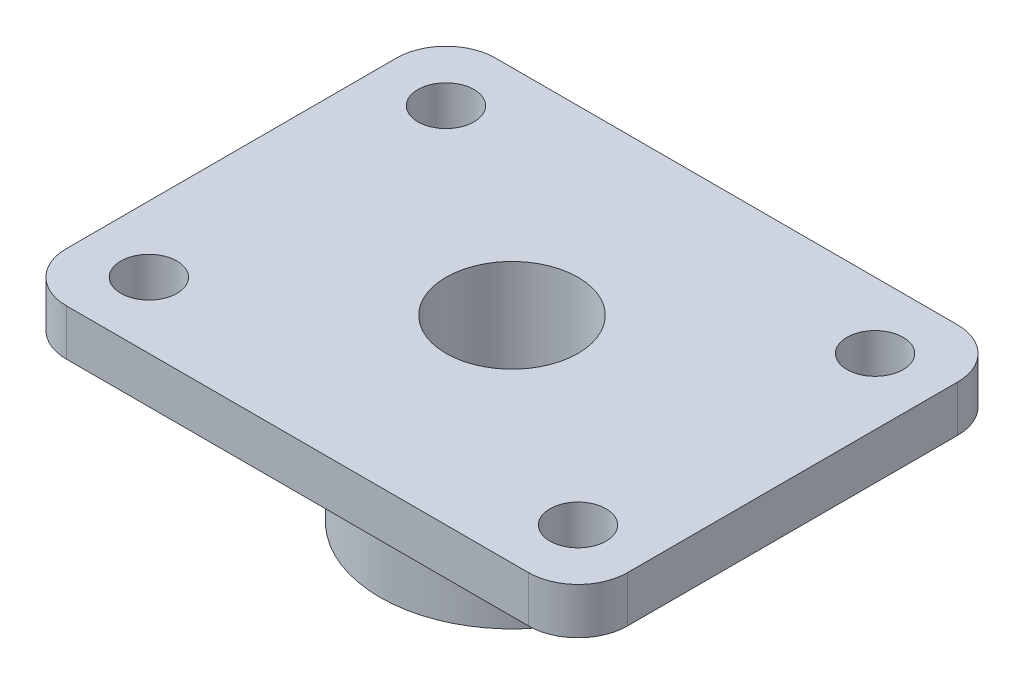
ISO-10303-21;
HEADER;
FILE_DESCRIPTION(('STEP AP214'),'2;1');
FILE_NAME('part.step','',(''),(''),'','','');
FILE_SCHEMA(('AUTOMOTIVE_DESIGN { 1 0 10303 214 1 1 1 1 }'));
ENDSEC;
DATA;
#1=APPLICATION_CONTEXT('core data for automotive mechanical design processes');
#2=APPLICATION_PROTOCOL_DEFINITION('international standard','automotive_design',2000,#1);
#3=PRODUCT_CONTEXT('',#1,'mechanical');
#4=PRODUCT('Part','Part','',(#3));
#5=PRODUCT_RELATED_PRODUCT_CATEGORY('part','',(#4));
#6=PRODUCT_DEFINITION_FORMATION('','',#4);
#7=PRODUCT_DEFINITION_CONTEXT('part definition',#1,'design');
#8=PRODUCT_DEFINITION('design','',#6,#7);
#9=PRODUCT_DEFINITION_SHAPE('','',#8);
#10=(LENGTH_UNIT() NAMED_UNIT(*) SI_UNIT(.MILLI.,.METRE.));
#11=(NAMED_UNIT(*) PLANE_ANGLE_UNIT() SI_UNIT($,.RADIAN.));
#12=(NAMED_UNIT(*) SI_UNIT($,.STERADIAN.) SOLID_ANGLE_UNIT());
#13=UNCERTAINTY_MEASURE_WITH_UNIT(LENGTH_MEASURE(1.E-05),#10,'distance_accuracy_value','');
#14=(GEOMETRIC_REPRESENTATION_CONTEXT(3) GLOBAL_UNCERTAINTY_ASSIGNED_CONTEXT((#13)) GLOBAL_UNIT_ASSIGNED_CONTEXT((#10,
#11,#12)) REPRESENTATION_CONTEXT('',''));
#15=CARTESIAN_POINT('',(0.,0.,0.));
#16=DIRECTION('',(0.,0.,1.));
#17=DIRECTION('',(1.,0.,0.));
#18=AXIS2_PLACEMENT_3D('',#15,#16,#17);
#19=CARTESIAN_POINT('',(70.,0.,50.));
#20=DIRECTION('',(0.,1.,0.));
#21=DIRECTION('',(0.,0.,1.));
#22=AXIS2_PLACEMENT_3D('',#19,#20,#21);
#23=PLANE('',#22);
#24=CARTESIAN_POINT('',(-65.0000000000003,0.,-44.9999999999995));
#25=DIRECTION('',(0.,1.,0.));
#26=DIRECTION('',(0.,0.,1.));
#27=AXIS2_PLACEMENT_3D('',#24,#25,#26);
#28=CIRCLE('',#27,8.50000000000001);
#29=CARTESIAN_POINT('',(-65.0000000000003,0.,-36.4999999999995));
#30=VERTEX_POINT('',#29);
#31=EDGE_CURVE('E205',#30,#30,#28,.T.);
#32=ORIENTED_EDGE('',*,*,#31,.T.);
#33=EDGE_LOOP('',(#32));
#34=FACE_BOUND('',#33,.T.);
#35=CARTESIAN_POINT('',(-64.9999999999997,0.,45.0000000000004));
#36=DIRECTION('',(0.,1.,0.));
#37=DIRECTION('',(0.,0.,-1.));
#38=AXIS2_PLACEMENT_3D('',#35,#36,#37);
#39=CIRCLE('',#38,8.49999999999998);
#40=CARTESIAN_POINT('',(-64.9999999999997,0.,36.5000000000005));
#41=VERTEX_POINT('',#40);
#42=EDGE_CURVE('E199',#41,#41,#39,.T.);
#43=ORIENTED_EDGE('',*,*,#42,.T.);
#44=EDGE_LOOP('',(#43));
#45=FACE_BOUND('',#44,.T.);
#46=CARTESIAN_POINT('',(65.,0.,-45.));
#47=DIRECTION('',(0.,1.,0.));
#48=DIRECTION('',(0.,0.,-1.));
#49=AXIS2_PLACEMENT_3D('',#46,#47,#48);
#50=CIRCLE('',#49,8.5);
#51=CARTESIAN_POINT('',(65.,0.,-53.5));
#52=VERTEX_POINT('',#51);
#53=EDGE_CURVE('E193',#52,#52,#50,.T.);
#54=ORIENTED_EDGE('',*,*,#53,.T.);
#55=EDGE_LOOP('',(#54));
#56=FACE_BOUND('',#55,.T.);
#57=CARTESIAN_POINT('',(65.,0.,45.));
#58=DIRECTION('',(0.,1.,0.));
#59=DIRECTION('',(0.,0.,1.));
#60=AXIS2_PLACEMENT_3D('',#57,#58,#59);
#61=CIRCLE('',#60,8.5);
#62=CARTESIAN_POINT('',(65.,0.,53.5));
#63=VERTEX_POINT('',#62);
#64=EDGE_CURVE('E187',#63,#63,#61,.T.);
#65=ORIENTED_EDGE('',*,*,#64,.T.);
#66=EDGE_LOOP('',(#65));
#67=FACE_BOUND('',#66,.T.);
#68=CARTESIAN_POINT('',(70.,0.,50.));
#69=DIRECTION('',(0.,1.,0.));
#70=DIRECTION('',(0.,0.,1.));
#71=AXIS2_PLACEMENT_3D('',#68,#69,#70);
#72=CIRCLE('',#71,15.);
#73=CARTESIAN_POINT('',(69.9999999999999,0.,65.));
#74=VERTEX_POINT('',#73);
#75=CARTESIAN_POINT('',(85.,0.,49.9999999999999));
#76=VERTEX_POINT('',#75);
#77=EDGE_CURVE('E132',#74,#76,#72,.T.);
#78=ORIENTED_EDGE('',*,*,#77,.F.);
#79=DIRECTION('',(1.,0.,0.));
#80=VECTOR('',#79,1.);
#81=CARTESIAN_POINT('',(-69.9999999999999,0.,65.));
#82=LINE('',#81,#80);
#83=CARTESIAN_POINT('',(-69.9999999999999,0.,65.));
#84=VERTEX_POINT('',#83);
#85=EDGE_CURVE('E85',#84,#74,#82,.T.);
#86=ORIENTED_EDGE('',*,*,#85,.F.);
#87=CARTESIAN_POINT('',(-70.,0.,50.));
#88=DIRECTION('',(0.,1.,0.));
#89=DIRECTION('',(0.,0.,1.));
#90=AXIS2_PLACEMENT_3D('',#87,#88,#89);
#91=CIRCLE('',#90,15.);
#92=CARTESIAN_POINT('',(-85.,0.,49.9999999999999));
#93=VERTEX_POINT('',#92);
#94=EDGE_CURVE('E79',#93,#84,#91,.T.);
#95=ORIENTED_EDGE('',*,*,#94,.F.);
#96=DIRECTION('',(0.,0.,1.));
#97=VECTOR('',#96,1.);
#98=CARTESIAN_POINT('',(-85.,0.,-49.9999999999999));
#99=LINE('',#98,#97);
#100=CARTESIAN_POINT('',(-85.,0.,-49.9999999999999));
#101=VERTEX_POINT('',#100);
#102=EDGE_CURVE('E122',#101,#93,#99,.T.);
#103=ORIENTED_EDGE('',*,*,#102,.F.);
#104=CARTESIAN_POINT('',(-70.,0.,-50.));
#105=DIRECTION('',(0.,1.,0.));
#106=DIRECTION('',(0.,0.,1.));
#107=AXIS2_PLACEMENT_3D('',#104,#105,#106);
#108=CIRCLE('',#107,15.);
#109=CARTESIAN_POINT('',(-69.9999999999999,0.,-65.));
#110=VERTEX_POINT('',#109);
#111=EDGE_CURVE('E142',#110,#101,#108,.T.);
#112=ORIENTED_EDGE('',*,*,#111,.F.);
#113=DIRECTION('',(-1.,0.,0.));
#114=VECTOR('',#113,1.);
#115=CARTESIAN_POINT('',(-69.9999999999999,0.,-65.));
#116=LINE('',#115,#114);
#117=CARTESIAN_POINT('',(69.9999999999999,0.,-65.));
#118=VERTEX_POINT('',#117);
#119=EDGE_CURVE('E140',#118,#110,#116,.T.);
#120=ORIENTED_EDGE('',*,*,#119,.F.);
#121=CARTESIAN_POINT('',(70.,0.,-50.));
#122=DIRECTION('',(0.,1.,0.));
#123=DIRECTION('',(0.,0.,-1.));
#124=AXIS2_PLACEMENT_3D('',#121,#122,#123);
#125=CIRCLE('',#124,15.);
#126=CARTESIAN_POINT('',(85.,0.,-49.9999999999999));
#127=VERTEX_POINT('',#126);
#128=EDGE_CURVE('E138',#127,#118,#125,.T.);
#129=ORIENTED_EDGE('',*,*,#128,.F.);
#130=DIRECTION('',(0.,0.,-1.));
#131=VECTOR('',#130,1.);
#132=CARTESIAN_POINT('',(85.,0.,-49.9999999999999));
#133=LINE('',#132,#131);
#134=EDGE_CURVE('E135',#76,#127,#133,.T.);
#135=ORIENTED_EDGE('',*,*,#134,.F.);
#136=EDGE_LOOP('',(#78,#86,#95,#103,#112,#120,#129,#135));
#137=FACE_BOUND('',#136,.T.);
#138=CARTESIAN_POINT('',(0.,0.,0.));
#139=DIRECTION('',(0.,1.,0.));
#140=DIRECTION('',(0.,0.,1.));
#141=AXIS2_PLACEMENT_3D('',#138,#139,#140);
#142=CIRCLE('',#141,40.);
#143=CARTESIAN_POINT('',(0.,0.,40.));
#144=VERTEX_POINT('',#143);
#145=EDGE_CURVE('E11',#144,#144,#142,.F.);
#146=ORIENTED_EDGE('',*,*,#145,.F.);
#147=EDGE_LOOP('',(#146));
#148=FACE_BOUND('',#147,.T.);
#149=ADVANCED_FACE('F33',(#34,#45,#56,#67,#137,#148),#23,.F.);
#150=CARTESIAN_POINT('',(70.,14.,50.));
#151=DIRECTION('',(0.,1.,0.));
#152=DIRECTION('',(0.,0.,1.));
#153=AXIS2_PLACEMENT_3D('',#150,#151,#152);
#154=PLANE('',#153);
#155=CARTESIAN_POINT('',(-64.9999999999997,14.,45.0000000000004));
#156=DIRECTION('',(0.,1.,0.));
#157=DIRECTION('',(0.,0.,-1.));
#158=AXIS2_PLACEMENT_3D('',#155,#156,#157);
#159=CIRCLE('',#158,8.49999999999998);
#160=CARTESIAN_POINT('',(-64.9999999999997,14.,36.5000000000005));
#161=VERTEX_POINT('',#160);
#162=EDGE_CURVE('E196',#161,#161,#159,.T.);
#163=ORIENTED_EDGE('',*,*,#162,.F.);
#164=EDGE_LOOP('',(#163));
#165=FACE_BOUND('',#164,.T.);
#166=CARTESIAN_POINT('',(65.,14.,45.));
#167=DIRECTION('',(0.,1.,0.));
#168=DIRECTION('',(0.,0.,1.));
#169=AXIS2_PLACEMENT_3D('',#166,#167,#168);
#170=CIRCLE('',#169,8.5);
#171=CARTESIAN_POINT('',(65.,14.,53.5));
#172=VERTEX_POINT('',#171);
#173=EDGE_CURVE('E186',#172,#172,#170,.T.);
#174=ORIENTED_EDGE('',*,*,#173,.F.);
#175=EDGE_LOOP('',(#174));
#176=FACE_BOUND('',#175,.T.);
#177=CARTESIAN_POINT('',(70.,14.,50.));
#178=DIRECTION('',(0.,1.,0.));
#179=DIRECTION('',(0.,0.,1.));
#180=AXIS2_PLACEMENT_3D('',#177,#178,#179);
#181=CIRCLE('',#180,15.);
#182=CARTESIAN_POINT('',(69.9999999999999,14.,65.));
#183=VERTEX_POINT('',#182);
#184=CARTESIAN_POINT('',(85.,14.,49.9999999999999));
#185=VERTEX_POINT('',#184);
#186=EDGE_CURVE('E147',#183,#185,#181,.T.);
#187=ORIENTED_EDGE('',*,*,#186,.T.);
#188=DIRECTION('',(0.,0.,-1.));
#189=VECTOR('',#188,1.);
#190=CARTESIAN_POINT('',(85.,14.,-49.9999999999999));
#191=LINE('',#190,#189);
#192=CARTESIAN_POINT('',(85.,14.,-49.9999999999999));
#193=VERTEX_POINT('',#192);
#194=EDGE_CURVE('E94',#185,#193,#191,.T.);
#195=ORIENTED_EDGE('',*,*,#194,.T.);
#196=CARTESIAN_POINT('',(70.,14.,-50.));
#197=DIRECTION('',(0.,1.,0.));
#198=DIRECTION('',(0.,0.,-1.));
#199=AXIS2_PLACEMENT_3D('',#196,#197,#198);
#200=CIRCLE('',#199,15.);
#201=CARTESIAN_POINT('',(69.9999999999999,14.,-65.));
#202=VERTEX_POINT('',#201);
#203=EDGE_CURVE('E178',#193,#202,#200,.T.);
#204=ORIENTED_EDGE('',*,*,#203,.T.);
#205=DIRECTION('',(-1.,0.,0.));
#206=VECTOR('',#205,1.);
#207=CARTESIAN_POINT('',(-69.9999999999999,14.,-65.));
#208=LINE('',#207,#206);
#209=CARTESIAN_POINT('',(-69.9999999999999,14.,-65.));
#210=VERTEX_POINT('',#209);
#211=EDGE_CURVE('E177',#202,#210,#208,.T.);
#212=ORIENTED_EDGE('',*,*,#211,.T.);
#213=CARTESIAN_POINT('',(-70.,14.,-50.));
#214=DIRECTION('',(0.,1.,0.));
#215=DIRECTION('',(0.,0.,1.));
#216=AXIS2_PLACEMENT_3D('',#213,#214,#215);
#217=CIRCLE('',#216,15.);
#218=CARTESIAN_POINT('',(-85.,14.,-49.9999999999999));
#219=VERTEX_POINT('',#218);
#220=EDGE_CURVE('E114',#210,#219,#217,.T.);
#221=ORIENTED_EDGE('',*,*,#220,.T.);
#222=DIRECTION('',(0.,0.,1.));
#223=VECTOR('',#222,1.);
#224=CARTESIAN_POINT('',(-85.,14.,-49.9999999999999));
#225=LINE('',#224,#223);
#226=CARTESIAN_POINT('',(-85.,14.,49.9999999999999));
#227=VERTEX_POINT('',#226);
#228=EDGE_CURVE('E107',#219,#227,#225,.T.);
#229=ORIENTED_EDGE('',*,*,#228,.T.);
#230=CARTESIAN_POINT('',(-70.,14.,50.));
#231=DIRECTION('',(0.,1.,0.));
#232=DIRECTION('',(0.,0.,1.));
#233=AXIS2_PLACEMENT_3D('',#230,#231,#232);
#234=CIRCLE('',#233,15.);
#235=CARTESIAN_POINT('',(-69.9999999999999,14.,65.));
#236=VERTEX_POINT('',#235);
#237=EDGE_CURVE('E112',#227,#236,#234,.T.);
#238=ORIENTED_EDGE('',*,*,#237,.T.);
#239=DIRECTION('',(1.,0.,0.));
#240=VECTOR('',#239,1.);
#241=CARTESIAN_POINT('',(-69.9999999999999,14.,65.));
#242=LINE('',#241,#240);
#243=EDGE_CURVE('E50',#236,#183,#242,.T.);
#244=ORIENTED_EDGE('',*,*,#243,.T.);
#245=EDGE_LOOP('',(#187,#195,#204,#212,#221,#229,#238,#244));
#246=FACE_BOUND('',#245,.T.);
#247=CARTESIAN_POINT('',(0.,14.,0.));
#248=DIRECTION('',(0.,1.,0.));
#249=DIRECTION('',(0.,0.,1.));
#250=AXIS2_PLACEMENT_3D('',#247,#248,#249);
#251=CIRCLE('',#250,20.);
#252=CARTESIAN_POINT('',(0.,14.,20.));
#253=VERTEX_POINT('',#252);
#254=EDGE_CURVE('E136',#253,#253,#251,.T.);
#255=ORIENTED_EDGE('',*,*,#254,.F.);
#256=EDGE_LOOP('',(#255));
#257=FACE_BOUND('',#256,.T.);
#258=CARTESIAN_POINT('',(65.,14.,-45.));
#259=DIRECTION('',(0.,1.,0.));
#260=DIRECTION('',(0.,0.,-1.));
#261=AXIS2_PLACEMENT_3D('',#258,#259,#260);
#262=CIRCLE('',#261,8.5);
#263=CARTESIAN_POINT('',(65.,14.,-53.5));
#264=VERTEX_POINT('',#263);
#265=EDGE_CURVE('E190',#264,#264,#262,.T.);
#266=ORIENTED_EDGE('',*,*,#265,.F.);
#267=EDGE_LOOP('',(#266));
#268=FACE_BOUND('',#267,.T.);
#269=CARTESIAN_POINT('',(-65.0000000000003,14.,-44.9999999999995));
#270=DIRECTION('',(0.,1.,0.));
#271=DIRECTION('',(0.,0.,1.));
#272=AXIS2_PLACEMENT_3D('',#269,#270,#271);
#273=CIRCLE('',#272,8.50000000000001);
#274=CARTESIAN_POINT('',(-65.0000000000003,14.,-36.4999999999995));
#275=VERTEX_POINT('',#274);
#276=EDGE_CURVE('E202',#275,#275,#273,.T.);
#277=ORIENTED_EDGE('',*,*,#276,.F.);
#278=EDGE_LOOP('',(#277));
#279=FACE_BOUND('',#278,.T.);
#280=ADVANCED_FACE('F109',(#165,#176,#246,#257,#268,#279),#154,.T.);
#281=CARTESIAN_POINT('',(70.,14.,50.));
#282=DIRECTION('',(0.,-1.,0.));
#283=DIRECTION('',(0.,0.,-1.));
#284=AXIS2_PLACEMENT_3D('',#281,#282,#283);
#285=CYLINDRICAL_SURFACE('',#284,15.);
#286=ORIENTED_EDGE('',*,*,#77,.T.);
#287=DIRECTION('',(0.,-1.,0.));
#288=VECTOR('',#287,1.);
#289=CARTESIAN_POINT('',(85.,14.,49.9999999999999));
#290=LINE('',#289,#288);
#291=EDGE_CURVE('E42',#185,#76,#290,.T.);
#292=ORIENTED_EDGE('',*,*,#291,.F.);
#293=ORIENTED_EDGE('',*,*,#186,.F.);
#294=DIRECTION('',(0.,-1.,0.));
#295=VECTOR('',#294,1.);
#296=CARTESIAN_POINT('',(69.9999999999999,14.,65.));
#297=LINE('',#296,#295);
#298=EDGE_CURVE('E128',#183,#74,#297,.T.);
#299=ORIENTED_EDGE('',*,*,#298,.T.);
#300=EDGE_LOOP('',(#286,#292,#293,#299));
#301=FACE_BOUND('',#300,.T.);
#302=ADVANCED_FACE('F35',(#301),#285,.T.);
#303=CARTESIAN_POINT('',(85.,14.,-49.9999999999999));
#304=DIRECTION('',(-1.,0.,0.));
#305=DIRECTION('',(0.,0.,1.));
#306=AXIS2_PLACEMENT_3D('',#303,#304,#305);
#307=PLANE('',#306);
#308=ORIENTED_EDGE('',*,*,#134,.T.);
#309=DIRECTION('',(0.,-1.,0.));
#310=VECTOR('',#309,1.);
#311=CARTESIAN_POINT('',(85.,14.,-49.9999999999999));
#312=LINE('',#311,#310);
#313=EDGE_CURVE('E157',#193,#127,#312,.T.);
#314=ORIENTED_EDGE('',*,*,#313,.F.);
#315=ORIENTED_EDGE('',*,*,#194,.F.);
#316=ORIENTED_EDGE('',*,*,#291,.T.);
#317=EDGE_LOOP('',(#308,#314,#315,#316));
#318=FACE_BOUND('',#317,.T.);
#319=ADVANCED_FACE('F160',(#318),#307,.F.);
#320=CARTESIAN_POINT('',(70.,14.,-50.));
#321=DIRECTION('',(0.,-1.,0.));
#322=DIRECTION('',(0.,0.,-1.));
#323=AXIS2_PLACEMENT_3D('',#320,#321,#322);
#324=CYLINDRICAL_SURFACE('',#323,15.);
#325=ORIENTED_EDGE('',*,*,#128,.T.);
#326=DIRECTION('',(0.,-1.,0.));
#327=VECTOR('',#326,1.);
#328=CARTESIAN_POINT('',(69.9999999999999,14.,-65.));
#329=LINE('',#328,#327);
#330=EDGE_CURVE('E154',#202,#118,#329,.T.);
#331=ORIENTED_EDGE('',*,*,#330,.F.);
#332=ORIENTED_EDGE('',*,*,#203,.F.);
#333=ORIENTED_EDGE('',*,*,#313,.T.);
#334=EDGE_LOOP('',(#325,#331,#332,#333));
#335=FACE_BOUND('',#334,.T.);
#336=ADVANCED_FACE('F171',(#335),#324,.T.);
#337=CARTESIAN_POINT('',(-69.9999999999999,14.,-65.));
#338=DIRECTION('',(0.,0.,1.));
#339=DIRECTION('',(1.,0.,0.));
#340=AXIS2_PLACEMENT_3D('',#337,#338,#339);
#341=PLANE('',#340);
#342=ORIENTED_EDGE('',*,*,#119,.T.);
#343=DIRECTION('',(0.,-1.,0.));
#344=VECTOR('',#343,1.);
#345=CARTESIAN_POINT('',(-69.9999999999999,14.,-65.));
#346=LINE('',#345,#344);
#347=EDGE_CURVE('E151',#210,#110,#346,.T.);
#348=ORIENTED_EDGE('',*,*,#347,.F.);
#349=ORIENTED_EDGE('',*,*,#211,.F.);
#350=ORIENTED_EDGE('',*,*,#330,.T.);
#351=EDGE_LOOP('',(#342,#348,#349,#350));
#352=FACE_BOUND('',#351,.T.);
#353=ADVANCED_FACE('F175',(#352),#341,.F.);
#354=CARTESIAN_POINT('',(-70.,14.,-50.));
#355=DIRECTION('',(0.,-1.,0.));
#356=DIRECTION('',(0.,0.,-1.));
#357=AXIS2_PLACEMENT_3D('',#354,#355,#356);
#358=CYLINDRICAL_SURFACE('',#357,15.);
#359=ORIENTED_EDGE('',*,*,#111,.T.);
#360=DIRECTION('',(0.,-1.,0.));
#361=VECTOR('',#360,1.);
#362=CARTESIAN_POINT('',(-85.,14.,-49.9999999999999));
#363=LINE('',#362,#361);
#364=EDGE_CURVE('E123',#219,#101,#363,.T.);
#365=ORIENTED_EDGE('',*,*,#364,.F.);
#366=ORIENTED_EDGE('',*,*,#220,.F.);
#367=ORIENTED_EDGE('',*,*,#347,.T.);
#368=EDGE_LOOP('',(#359,#365,#366,#367));
#369=FACE_BOUND('',#368,.T.);
#370=ADVANCED_FACE('F252',(#369),#358,.T.);
#371=CARTESIAN_POINT('',(-85.,14.,-49.9999999999999));
#372=DIRECTION('',(1.,0.,0.));
#373=DIRECTION('',(0.,0.,-1.));
#374=AXIS2_PLACEMENT_3D('',#371,#372,#373);
#375=PLANE('',#374);
#376=ORIENTED_EDGE('',*,*,#102,.T.);
#377=DIRECTION('',(0.,-1.,0.));
#378=VECTOR('',#377,1.);
#379=CARTESIAN_POINT('',(-85.,14.,49.9999999999999));
#380=LINE('',#379,#378);
#381=EDGE_CURVE('E119',#227,#93,#380,.T.);
#382=ORIENTED_EDGE('',*,*,#381,.F.);
#383=ORIENTED_EDGE('',*,*,#228,.F.);
#384=ORIENTED_EDGE('',*,*,#364,.T.);
#385=EDGE_LOOP('',(#376,#382,#383,#384));
#386=FACE_BOUND('',#385,.T.);
#387=ADVANCED_FACE('F120',(#386),#375,.F.);
#388=CARTESIAN_POINT('',(-70.,14.,50.));
#389=DIRECTION('',(0.,-1.,0.));
#390=DIRECTION('',(0.,0.,-1.));
#391=AXIS2_PLACEMENT_3D('',#388,#389,#390);
#392=CYLINDRICAL_SURFACE('',#391,15.);
#393=ORIENTED_EDGE('',*,*,#94,.T.);
#394=DIRECTION('',(0.,-1.,0.));
#395=VECTOR('',#394,1.);
#396=CARTESIAN_POINT('',(-69.9999999999999,14.,65.));
#397=LINE('',#396,#395);
#398=EDGE_CURVE('E124',#236,#84,#397,.T.);
#399=ORIENTED_EDGE('',*,*,#398,.F.);
#400=ORIENTED_EDGE('',*,*,#237,.F.);
#401=ORIENTED_EDGE('',*,*,#381,.T.);
#402=EDGE_LOOP('',(#393,#399,#400,#401));
#403=FACE_BOUND('',#402,.T.);
#404=ADVANCED_FACE('F126',(#403),#392,.T.);
#405=CARTESIAN_POINT('',(-69.9999999999999,14.,65.));
#406=DIRECTION('',(0.,0.,-1.));
#407=DIRECTION('',(-1.,0.,0.));
#408=AXIS2_PLACEMENT_3D('',#405,#406,#407);
#409=PLANE('',#408);
#410=ORIENTED_EDGE('',*,*,#85,.T.);
#411=ORIENTED_EDGE('',*,*,#298,.F.);
#412=ORIENTED_EDGE('',*,*,#243,.F.);
#413=ORIENTED_EDGE('',*,*,#398,.T.);
#414=EDGE_LOOP('',(#410,#411,#412,#413));
#415=FACE_BOUND('',#414,.T.);
#416=ADVANCED_FACE('F245',(#415),#409,.F.);
#417=CARTESIAN_POINT('',(0.,14.,0.));
#418=DIRECTION('',(0.,-1.,0.));
#419=DIRECTION('',(0.,0.,-1.));
#420=AXIS2_PLACEMENT_3D('',#417,#418,#419);
#421=CYLINDRICAL_SURFACE('',#420,20.);
#422=ORIENTED_EDGE('',*,*,#254,.T.);
#423=EDGE_LOOP('',(#422));
#424=FACE_BOUND('',#423,.T.);
#425=CARTESIAN_POINT('',(0.,-40.,0.));
#426=DIRECTION('',(0.,-1.,0.));
#427=DIRECTION('',(0.,0.,-1.));
#428=AXIS2_PLACEMENT_3D('',#425,#426,#427);
#429=CIRCLE('',#428,20.);
#430=CARTESIAN_POINT('',(0.,-40.,-20.));
#431=VERTEX_POINT('',#430);
#432=EDGE_CURVE('E213',#431,#431,#429,.T.);
#433=ORIENTED_EDGE('',*,*,#432,.T.);
#434=EDGE_LOOP('',(#433));
#435=FACE_BOUND('',#434,.T.);
#436=ADVANCED_FACE('F217',(#424,#435),#421,.F.);
#437=CARTESIAN_POINT('',(65.,14.,45.));
#438=DIRECTION('',(0.,-1.,0.));
#439=DIRECTION('',(0.,0.,-1.));
#440=AXIS2_PLACEMENT_3D('',#437,#438,#439);
#441=CYLINDRICAL_SURFACE('',#440,8.5);
#442=ORIENTED_EDGE('',*,*,#173,.T.);
#443=EDGE_LOOP('',(#442));
#444=FACE_BOUND('',#443,.T.);
#445=ORIENTED_EDGE('',*,*,#64,.F.);
#446=EDGE_LOOP('',(#445));
#447=FACE_BOUND('',#446,.T.);
#448=ADVANCED_FACE('F316',(#444,#447),#441,.F.);
#449=CARTESIAN_POINT('',(65.,14.,-45.));
#450=DIRECTION('',(0.,-1.,0.));
#451=DIRECTION('',(0.,0.,-1.));
#452=AXIS2_PLACEMENT_3D('',#449,#450,#451);
#453=CYLINDRICAL_SURFACE('',#452,8.5);
#454=ORIENTED_EDGE('',*,*,#265,.T.);
#455=EDGE_LOOP('',(#454));
#456=FACE_BOUND('',#455,.T.);
#457=ORIENTED_EDGE('',*,*,#53,.F.);
#458=EDGE_LOOP('',(#457));
#459=FACE_BOUND('',#458,.T.);
#460=ADVANCED_FACE('F327',(#456,#459),#453,.F.);
#461=CARTESIAN_POINT('',(-64.9999999999997,14.,45.0000000000004));
#462=DIRECTION('',(0.,-1.,0.));
#463=DIRECTION('',(0.,0.,-1.));
#464=AXIS2_PLACEMENT_3D('',#461,#462,#463);
#465=CYLINDRICAL_SURFACE('',#464,8.49999999999998);
#466=ORIENTED_EDGE('',*,*,#162,.T.);
#467=EDGE_LOOP('',(#466));
#468=FACE_BOUND('',#467,.T.);
#469=ORIENTED_EDGE('',*,*,#42,.F.);
#470=EDGE_LOOP('',(#469));
#471=FACE_BOUND('',#470,.T.);
#472=ADVANCED_FACE('F231',(#468,#471),#465,.F.);
#473=CARTESIAN_POINT('',(-65.0000000000003,14.,-44.9999999999995));
#474=DIRECTION('',(0.,-1.,0.));
#475=DIRECTION('',(0.,0.,-1.));
#476=AXIS2_PLACEMENT_3D('',#473,#474,#475);
#477=CYLINDRICAL_SURFACE('',#476,8.50000000000001);
#478=ORIENTED_EDGE('',*,*,#276,.T.);
#479=EDGE_LOOP('',(#478));
#480=FACE_BOUND('',#479,.T.);
#481=ORIENTED_EDGE('',*,*,#31,.F.);
#482=EDGE_LOOP('',(#481));
#483=FACE_BOUND('',#482,.T.);
#484=ADVANCED_FACE('F222',(#480,#483),#477,.F.);
#485=CARTESIAN_POINT('',(0.,-40.,0.));
#486=DIRECTION('',(0.,-1.,0.));
#487=DIRECTION('',(0.,0.,-1.));
#488=AXIS2_PLACEMENT_3D('',#485,#486,#487);
#489=PLANE('',#488);
#490=CARTESIAN_POINT('',(0.,-40.,0.));
#491=DIRECTION('',(0.,-1.,0.));
#492=DIRECTION('',(0.,0.,-1.));
#493=AXIS2_PLACEMENT_3D('',#490,#491,#492);
#494=CIRCLE('',#493,40.);
#495=CARTESIAN_POINT('',(0.,-40.,-40.));
#496=VERTEX_POINT('',#495);
#497=EDGE_CURVE('E208',#496,#496,#494,.T.);
#498=ORIENTED_EDGE('',*,*,#497,.T.);
#499=EDGE_LOOP('',(#498));
#500=FACE_BOUND('',#499,.T.);
#501=ORIENTED_EDGE('',*,*,#432,.F.);
#502=EDGE_LOOP('',(#501));
#503=FACE_BOUND('',#502,.T.);
#504=ADVANCED_FACE('F219',(#500,#503),#489,.T.);
#505=CARTESIAN_POINT('',(0.,-40.,0.));
#506=DIRECTION('',(0.,1.,0.));
#507=DIRECTION('',(0.,0.,1.));
#508=AXIS2_PLACEMENT_3D('',#505,#506,#507);
#509=CYLINDRICAL_SURFACE('',#508,40.);
#510=ORIENTED_EDGE('',*,*,#497,.F.);
#511=EDGE_LOOP('',(#510));
#512=FACE_BOUND('',#511,.T.);
#513=ORIENTED_EDGE('',*,*,#145,.T.);
#514=EDGE_LOOP('',(#513));
#515=FACE_BOUND('',#514,.T.);
#516=ADVANCED_FACE('F221',(#512,#515),#509,.T.);
#517=CLOSED_SHELL('',(#149,#280,#302,#319,#336,#353,#370,#387,#404,#416,#436,#448,#460,#472,
#484,#504,#516));
#518=MANIFOLD_SOLID_BREP('B2',#517);
#519=ADVANCED_BREP_SHAPE_REPRESENTATION('',(#18,#518),#14);
#520=SHAPE_DEFINITION_REPRESENTATION(#9,#519);
ENDSEC;
END-ISO-10303-21;
